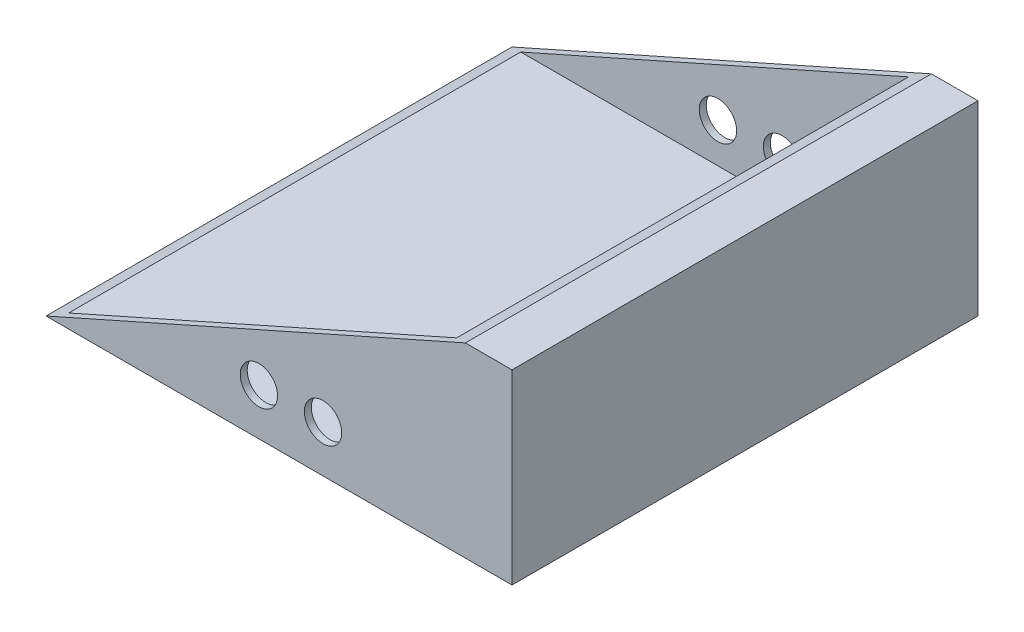
ISO-10303-21;
HEADER;
FILE_DESCRIPTION(('STEP AP214'),'2;1');
FILE_NAME('part.step','',(''),(''),'','','');
FILE_SCHEMA(('AUTOMOTIVE_DESIGN { 1 0 10303 214 1 1 1 1 }'));
ENDSEC;
DATA;
#1=APPLICATION_CONTEXT('core data for automotive mechanical design processes');
#2=APPLICATION_PROTOCOL_DEFINITION('international standard','automotive_design',2000,#1);
#3=PRODUCT_CONTEXT('',#1,'mechanical');
#4=PRODUCT('Part','Part','',(#3));
#5=PRODUCT_RELATED_PRODUCT_CATEGORY('part','',(#4));
#6=PRODUCT_DEFINITION_FORMATION('','',#4);
#7=PRODUCT_DEFINITION_CONTEXT('part definition',#1,'design');
#8=PRODUCT_DEFINITION('design','',#6,#7);
#9=PRODUCT_DEFINITION_SHAPE('','',#8);
#10=(LENGTH_UNIT() NAMED_UNIT(*) SI_UNIT(.MILLI.,.METRE.));
#11=(NAMED_UNIT(*) PLANE_ANGLE_UNIT() SI_UNIT($,.RADIAN.));
#12=(NAMED_UNIT(*) SI_UNIT($,.STERADIAN.) SOLID_ANGLE_UNIT());
#13=UNCERTAINTY_MEASURE_WITH_UNIT(LENGTH_MEASURE(1.E-05),#10,'distance_accuracy_value','');
#14=(GEOMETRIC_REPRESENTATION_CONTEXT(3) GLOBAL_UNCERTAINTY_ASSIGNED_CONTEXT((#13)) GLOBAL_UNIT_ASSIGNED_CONTEXT((#10,
#11,#12)) REPRESENTATION_CONTEXT('',''));
#15=CARTESIAN_POINT('',(0.,0.,0.));
#16=DIRECTION('',(0.,0.,1.));
#17=DIRECTION('',(1.,0.,0.));
#18=AXIS2_PLACEMENT_3D('',#15,#16,#17);
#19=CARTESIAN_POINT('',(180.,80.,200.));
#20=DIRECTION('',(0.406138466053448,-0.913811548620257,0.));
#21=DIRECTION('',(0.913811548620257,0.406138466053448,0.));
#22=AXIS2_PLACEMENT_3D('',#19,#20,#21);
#23=PLANE('',#22);
#24=DIRECTION('',(-0.913811548620257,-0.406138466053448,0.));
#25=VECTOR('',#24,1.);
#26=CARTESIAN_POINT('',(180.,80.,0.));
#27=LINE('',#26,#25);
#28=CARTESIAN_POINT('',(180.,80.,0.));
#29=VERTEX_POINT('',#28);
#30=CARTESIAN_POINT('',(0.,0.,0.));
#31=VERTEX_POINT('',#30);
#32=EDGE_CURVE('E150',#29,#31,#27,.T.);
#33=ORIENTED_EDGE('',*,*,#32,.T.);
#34=DIRECTION('',(0.,0.,-1.));
#35=VECTOR('',#34,1.);
#36=CARTESIAN_POINT('',(0.,0.,200.));
#37=LINE('',#36,#35);
#38=CARTESIAN_POINT('',(0.,0.,200.));
#39=VERTEX_POINT('',#38);
#40=EDGE_CURVE('E11',#39,#31,#37,.T.);
#41=ORIENTED_EDGE('',*,*,#40,.F.);
#42=DIRECTION('',(-0.913811548620257,-0.406138466053448,0.));
#43=VECTOR('',#42,1.);
#44=CARTESIAN_POINT('',(180.,80.,200.));
#45=LINE('',#44,#43);
#46=CARTESIAN_POINT('',(180.,80.,200.));
#47=VERTEX_POINT('',#46);
#48=EDGE_CURVE('E156',#47,#39,#45,.T.);
#49=ORIENTED_EDGE('',*,*,#48,.F.);
#50=DIRECTION('',(0.,0.,-1.));
#51=VECTOR('',#50,1.);
#52=CARTESIAN_POINT('',(180.,80.,200.));
#53=LINE('',#52,#51);
#54=EDGE_CURVE('E162',#47,#29,#53,.T.);
#55=ORIENTED_EDGE('',*,*,#54,.T.);
#56=EDGE_LOOP('',(#33,#41,#49,#55));
#57=FACE_BOUND('',#56,.T.);
#58=DIRECTION('',(-0.913811548620257,-0.406138466053448,0.));
#59=VECTOR('',#58,1.);
#60=CARTESIAN_POINT('',(0.,0.,3.));
#61=LINE('',#60,#59);
#62=CARTESIAN_POINT('',(173.25,77.,3.));
#63=VERTEX_POINT('',#62);
#64=CARTESIAN_POINT('',(6.74999999999997,3.,3.));
#65=VERTEX_POINT('',#64);
#66=EDGE_CURVE('E121',#63,#65,#61,.T.);
#67=ORIENTED_EDGE('',*,*,#66,.F.);
#68=DIRECTION('',(0.,0.,-1.));
#69=VECTOR('',#68,1.);
#70=CARTESIAN_POINT('',(173.25,77.,200.));
#71=LINE('',#70,#69);
#72=CARTESIAN_POINT('',(173.25,77.,197.));
#73=VERTEX_POINT('',#72);
#74=EDGE_CURVE('E144',#73,#63,#71,.T.);
#75=ORIENTED_EDGE('',*,*,#74,.F.);
#76=DIRECTION('',(-0.913811548620257,-0.406138466053448,0.));
#77=VECTOR('',#76,1.);
#78=CARTESIAN_POINT('',(0.,0.,197.));
#79=LINE('',#78,#77);
#80=CARTESIAN_POINT('',(6.74999999999997,3.,197.));
#81=VERTEX_POINT('',#80);
#82=EDGE_CURVE('E55',#73,#81,#79,.T.);
#83=ORIENTED_EDGE('',*,*,#82,.T.);
#84=DIRECTION('',(0.,0.,-1.));
#85=VECTOR('',#84,1.);
#86=CARTESIAN_POINT('',(6.74999999999999,3.,200.));
#87=LINE('',#86,#85);
#88=EDGE_CURVE('E132',#81,#65,#87,.T.);
#89=ORIENTED_EDGE('',*,*,#88,.T.);
#90=EDGE_LOOP('',(#67,#75,#83,#89));
#91=FACE_BOUND('',#90,.T.);
#92=ADVANCED_FACE('F39',(#57,#91),#23,.F.);
#93=CARTESIAN_POINT('',(0.,0.,200.));
#94=DIRECTION('',(0.,1.,0.));
#95=DIRECTION('',(0.,0.,1.));
#96=AXIS2_PLACEMENT_3D('',#93,#94,#95);
#97=PLANE('',#96);
#98=DIRECTION('',(1.,0.,0.));
#99=VECTOR('',#98,1.);
#100=CARTESIAN_POINT('',(0.,0.,0.));
#101=LINE('',#100,#99);
#102=CARTESIAN_POINT('',(200.,0.,0.));
#103=VERTEX_POINT('',#102);
#104=EDGE_CURVE('E165',#31,#103,#101,.T.);
#105=ORIENTED_EDGE('',*,*,#104,.T.);
#106=DIRECTION('',(0.,0.,-1.));
#107=VECTOR('',#106,1.);
#108=CARTESIAN_POINT('',(200.,0.,200.));
#109=LINE('',#108,#107);
#110=CARTESIAN_POINT('',(200.,0.,200.));
#111=VERTEX_POINT('',#110);
#112=EDGE_CURVE('E47',#111,#103,#109,.T.);
#113=ORIENTED_EDGE('',*,*,#112,.F.);
#114=DIRECTION('',(1.,0.,0.));
#115=VECTOR('',#114,1.);
#116=CARTESIAN_POINT('',(0.,0.,200.));
#117=LINE('',#116,#115);
#118=EDGE_CURVE('E92',#39,#111,#117,.T.);
#119=ORIENTED_EDGE('',*,*,#118,.F.);
#120=ORIENTED_EDGE('',*,*,#40,.T.);
#121=EDGE_LOOP('',(#105,#113,#119,#120));
#122=FACE_BOUND('',#121,.T.);
#123=ADVANCED_FACE('F213',(#122),#97,.F.);
#124=CARTESIAN_POINT('',(200.,0.,200.));
#125=DIRECTION('',(-1.,0.,0.));
#126=DIRECTION('',(0.,0.,1.));
#127=AXIS2_PLACEMENT_3D('',#124,#125,#126);
#128=PLANE('',#127);
#129=DIRECTION('',(0.,1.,0.));
#130=VECTOR('',#129,1.);
#131=CARTESIAN_POINT('',(200.,0.,0.));
#132=LINE('',#131,#130);
#133=CARTESIAN_POINT('',(200.,80.,0.));
#134=VERTEX_POINT('',#133);
#135=EDGE_CURVE('E167',#103,#134,#132,.T.);
#136=ORIENTED_EDGE('',*,*,#135,.T.);
#137=DIRECTION('',(0.,0.,-1.));
#138=VECTOR('',#137,1.);
#139=CARTESIAN_POINT('',(200.,80.,200.));
#140=LINE('',#139,#138);
#141=CARTESIAN_POINT('',(200.,80.,200.));
#142=VERTEX_POINT('',#141);
#143=EDGE_CURVE('E171',#142,#134,#140,.T.);
#144=ORIENTED_EDGE('',*,*,#143,.F.);
#145=DIRECTION('',(0.,1.,0.));
#146=VECTOR('',#145,1.);
#147=CARTESIAN_POINT('',(200.,0.,200.));
#148=LINE('',#147,#146);
#149=EDGE_CURVE('E159',#111,#142,#148,.T.);
#150=ORIENTED_EDGE('',*,*,#149,.F.);
#151=ORIENTED_EDGE('',*,*,#112,.T.);
#152=EDGE_LOOP('',(#136,#144,#150,#151));
#153=FACE_BOUND('',#152,.T.);
#154=ADVANCED_FACE('F218',(#153),#128,.F.);
#155=CARTESIAN_POINT('',(200.,80.,200.));
#156=DIRECTION('',(0.,-1.,0.));
#157=DIRECTION('',(1.,0.,0.));
#158=AXIS2_PLACEMENT_3D('',#155,#156,#157);
#159=PLANE('',#158);
#160=DIRECTION('',(-1.,0.,0.));
#161=VECTOR('',#160,1.);
#162=CARTESIAN_POINT('',(200.,80.,0.));
#163=LINE('',#162,#161);
#164=EDGE_CURVE('E85',#134,#29,#163,.T.);
#165=ORIENTED_EDGE('',*,*,#164,.T.);
#166=ORIENTED_EDGE('',*,*,#54,.F.);
#167=DIRECTION('',(-1.,0.,0.));
#168=VECTOR('',#167,1.);
#169=CARTESIAN_POINT('',(200.,80.,200.));
#170=LINE('',#169,#168);
#171=EDGE_CURVE('E64',#142,#47,#170,.T.);
#172=ORIENTED_EDGE('',*,*,#171,.F.);
#173=ORIENTED_EDGE('',*,*,#143,.T.);
#174=EDGE_LOOP('',(#165,#166,#172,#173));
#175=FACE_BOUND('',#174,.T.);
#176=ADVANCED_FACE('F205',(#175),#159,.F.);
#177=CARTESIAN_POINT('',(0.,0.,200.));
#178=DIRECTION('',(0.,0.,-1.));
#179=DIRECTION('',(-1.,0.,0.));
#180=AXIS2_PLACEMENT_3D('',#177,#178,#179);
#181=PLANE('',#180);
#182=CARTESIAN_POINT('',(91.3790345528968,20.,200.));
#183=DIRECTION('',(0.,0.,1.));
#184=DIRECTION('',(1.,0.,0.));
#185=AXIS2_PLACEMENT_3D('',#182,#183,#184);
#186=CIRCLE('',#185,8.02);
#187=CARTESIAN_POINT('',(99.3990345528968,20.,200.));
#188=VERTEX_POINT('',#187);
#189=EDGE_CURVE('E178',#188,#188,#186,.T.);
#190=ORIENTED_EDGE('',*,*,#189,.F.);
#191=EDGE_LOOP('',(#190));
#192=FACE_BOUND('',#191,.T.);
#193=CARTESIAN_POINT('',(118.899034552897,20.,200.));
#194=DIRECTION('',(0.,0.,1.));
#195=DIRECTION('',(1.,0.,0.));
#196=AXIS2_PLACEMENT_3D('',#193,#194,#195);
#197=CIRCLE('',#196,8.02000000000002);
#198=CARTESIAN_POINT('',(126.919034552897,20.,200.));
#199=VERTEX_POINT('',#198);
#200=EDGE_CURVE('E186',#199,#199,#197,.T.);
#201=ORIENTED_EDGE('',*,*,#200,.F.);
#202=EDGE_LOOP('',(#201));
#203=FACE_BOUND('',#202,.T.);
#204=ORIENTED_EDGE('',*,*,#48,.T.);
#205=ORIENTED_EDGE('',*,*,#118,.T.);
#206=ORIENTED_EDGE('',*,*,#149,.T.);
#207=ORIENTED_EDGE('',*,*,#171,.T.);
#208=EDGE_LOOP('',(#204,#205,#206,#207));
#209=FACE_BOUND('',#208,.T.);
#210=ADVANCED_FACE('F202',(#192,#203,#209),#181,.F.);
#211=CARTESIAN_POINT('',(0.,0.,0.));
#212=DIRECTION('',(0.,0.,-1.));
#213=DIRECTION('',(-1.,0.,0.));
#214=AXIS2_PLACEMENT_3D('',#211,#212,#213);
#215=PLANE('',#214);
#216=CARTESIAN_POINT('',(91.3790345528968,20.,0.));
#217=DIRECTION('',(0.,0.,1.));
#218=DIRECTION('',(1.,0.,0.));
#219=AXIS2_PLACEMENT_3D('',#216,#217,#218);
#220=CIRCLE('',#219,8.02);
#221=CARTESIAN_POINT('',(99.3990345528968,20.,0.));
#222=VERTEX_POINT('',#221);
#223=EDGE_CURVE('E182',#222,#222,#220,.T.);
#224=ORIENTED_EDGE('',*,*,#223,.T.);
#225=EDGE_LOOP('',(#224));
#226=FACE_BOUND('',#225,.T.);
#227=CARTESIAN_POINT('',(118.899034552897,20.,0.));
#228=DIRECTION('',(0.,0.,1.));
#229=DIRECTION('',(1.,0.,0.));
#230=AXIS2_PLACEMENT_3D('',#227,#228,#229);
#231=CIRCLE('',#230,8.02000000000002);
#232=CARTESIAN_POINT('',(126.919034552897,20.,0.));
#233=VERTEX_POINT('',#232);
#234=EDGE_CURVE('E188',#233,#233,#231,.T.);
#235=ORIENTED_EDGE('',*,*,#234,.T.);
#236=EDGE_LOOP('',(#235));
#237=FACE_BOUND('',#236,.T.);
#238=ORIENTED_EDGE('',*,*,#32,.F.);
#239=ORIENTED_EDGE('',*,*,#164,.F.);
#240=ORIENTED_EDGE('',*,*,#135,.F.);
#241=ORIENTED_EDGE('',*,*,#104,.F.);
#242=EDGE_LOOP('',(#238,#239,#240,#241));
#243=FACE_BOUND('',#242,.T.);
#244=ADVANCED_FACE('F204',(#226,#237,#243),#215,.T.);
#245=CARTESIAN_POINT('',(0.,3.,200.));
#246=DIRECTION('',(0.,1.,0.));
#247=DIRECTION('',(0.,0.,1.));
#248=AXIS2_PLACEMENT_3D('',#245,#246,#247);
#249=PLANE('',#248);
#250=DIRECTION('',(1.,0.,0.));
#251=VECTOR('',#250,1.);
#252=CARTESIAN_POINT('',(0.,3.,3.));
#253=LINE('',#252,#251);
#254=CARTESIAN_POINT('',(197.,3.,3.));
#255=VERTEX_POINT('',#254);
#256=EDGE_CURVE('E114',#65,#255,#253,.T.);
#257=ORIENTED_EDGE('',*,*,#256,.F.);
#258=ORIENTED_EDGE('',*,*,#88,.F.);
#259=DIRECTION('',(1.,0.,0.));
#260=VECTOR('',#259,1.);
#261=CARTESIAN_POINT('',(0.,3.,197.));
#262=LINE('',#261,#260);
#263=CARTESIAN_POINT('',(197.,3.,197.));
#264=VERTEX_POINT('',#263);
#265=EDGE_CURVE('E129',#81,#264,#262,.T.);
#266=ORIENTED_EDGE('',*,*,#265,.T.);
#267=DIRECTION('',(0.,0.,-1.));
#268=VECTOR('',#267,1.);
#269=CARTESIAN_POINT('',(197.,3.,200.));
#270=LINE('',#269,#268);
#271=EDGE_CURVE('E127',#264,#255,#270,.T.);
#272=ORIENTED_EDGE('',*,*,#271,.T.);
#273=EDGE_LOOP('',(#257,#258,#266,#272));
#274=FACE_BOUND('',#273,.T.);
#275=ADVANCED_FACE('F128',(#274),#249,.T.);
#276=CARTESIAN_POINT('',(197.,0.,200.));
#277=DIRECTION('',(-1.,0.,0.));
#278=DIRECTION('',(0.,0.,1.));
#279=AXIS2_PLACEMENT_3D('',#276,#277,#278);
#280=PLANE('',#279);
#281=DIRECTION('',(0.,1.,0.));
#282=VECTOR('',#281,1.);
#283=CARTESIAN_POINT('',(197.,0.,3.));
#284=LINE('',#283,#282);
#285=CARTESIAN_POINT('',(197.,77.,3.));
#286=VERTEX_POINT('',#285);
#287=EDGE_CURVE('E118',#255,#286,#284,.T.);
#288=ORIENTED_EDGE('',*,*,#287,.F.);
#289=ORIENTED_EDGE('',*,*,#271,.F.);
#290=DIRECTION('',(0.,1.,0.));
#291=VECTOR('',#290,1.);
#292=CARTESIAN_POINT('',(197.,0.,197.));
#293=LINE('',#292,#291);
#294=CARTESIAN_POINT('',(197.,77.,197.));
#295=VERTEX_POINT('',#294);
#296=EDGE_CURVE('E145',#264,#295,#293,.T.);
#297=ORIENTED_EDGE('',*,*,#296,.T.);
#298=DIRECTION('',(0.,0.,-1.));
#299=VECTOR('',#298,1.);
#300=CARTESIAN_POINT('',(197.,77.,200.));
#301=LINE('',#300,#299);
#302=EDGE_CURVE('E133',#295,#286,#301,.T.);
#303=ORIENTED_EDGE('',*,*,#302,.T.);
#304=EDGE_LOOP('',(#288,#289,#297,#303));
#305=FACE_BOUND('',#304,.T.);
#306=ADVANCED_FACE('F135',(#305),#280,.T.);
#307=CARTESIAN_POINT('',(200.,77.,200.));
#308=DIRECTION('',(0.,-1.,0.));
#309=DIRECTION('',(1.,0.,0.));
#310=AXIS2_PLACEMENT_3D('',#307,#308,#309);
#311=PLANE('',#310);
#312=DIRECTION('',(-1.,0.,0.));
#313=VECTOR('',#312,1.);
#314=CARTESIAN_POINT('',(0.,76.9999999999999,3.));
#315=LINE('',#314,#313);
#316=EDGE_CURVE('E138',#286,#63,#315,.T.);
#317=ORIENTED_EDGE('',*,*,#316,.F.);
#318=ORIENTED_EDGE('',*,*,#302,.F.);
#319=DIRECTION('',(-1.,0.,0.));
#320=VECTOR('',#319,1.);
#321=CARTESIAN_POINT('',(0.,76.9999999999999,197.));
#322=LINE('',#321,#320);
#323=EDGE_CURVE('E146',#295,#73,#322,.T.);
#324=ORIENTED_EDGE('',*,*,#323,.T.);
#325=ORIENTED_EDGE('',*,*,#74,.T.);
#326=EDGE_LOOP('',(#317,#318,#324,#325));
#327=FACE_BOUND('',#326,.T.);
#328=ADVANCED_FACE('F254',(#327),#311,.T.);
#329=CARTESIAN_POINT('',(0.,0.,197.));
#330=DIRECTION('',(0.,0.,-1.));
#331=DIRECTION('',(-1.,0.,0.));
#332=AXIS2_PLACEMENT_3D('',#329,#330,#331);
#333=PLANE('',#332);
#334=CARTESIAN_POINT('',(91.3790345528968,20.,197.));
#335=DIRECTION('',(0.,0.,-1.));
#336=DIRECTION('',(-1.,0.,0.));
#337=AXIS2_PLACEMENT_3D('',#334,#335,#336);
#338=CIRCLE('',#337,8.02);
#339=CARTESIAN_POINT('',(83.3590345528968,20.,197.));
#340=VERTEX_POINT('',#339);
#341=EDGE_CURVE('E155',#340,#340,#338,.T.);
#342=ORIENTED_EDGE('',*,*,#341,.F.);
#343=EDGE_LOOP('',(#342));
#344=FACE_BOUND('',#343,.T.);
#345=CARTESIAN_POINT('',(118.899034552897,20.,197.));
#346=DIRECTION('',(0.,0.,-1.));
#347=DIRECTION('',(-1.,0.,0.));
#348=AXIS2_PLACEMENT_3D('',#345,#346,#347);
#349=CIRCLE('',#348,8.02000000000002);
#350=CARTESIAN_POINT('',(110.879034552897,20.,197.));
#351=VERTEX_POINT('',#350);
#352=EDGE_CURVE('E175',#351,#351,#349,.T.);
#353=ORIENTED_EDGE('',*,*,#352,.F.);
#354=EDGE_LOOP('',(#353));
#355=FACE_BOUND('',#354,.T.);
#356=ORIENTED_EDGE('',*,*,#82,.F.);
#357=ORIENTED_EDGE('',*,*,#323,.F.);
#358=ORIENTED_EDGE('',*,*,#296,.F.);
#359=ORIENTED_EDGE('',*,*,#265,.F.);
#360=EDGE_LOOP('',(#356,#357,#358,#359));
#361=FACE_BOUND('',#360,.T.);
#362=ADVANCED_FACE('F259',(#344,#355,#361),#333,.T.);
#363=CARTESIAN_POINT('',(0.,0.,3.));
#364=DIRECTION('',(0.,0.,-1.));
#365=DIRECTION('',(-1.,0.,0.));
#366=AXIS2_PLACEMENT_3D('',#363,#364,#365);
#367=PLANE('',#366);
#368=CARTESIAN_POINT('',(91.3790345528968,20.,3.));
#369=DIRECTION('',(0.,0.,-1.));
#370=DIRECTION('',(-1.,0.,0.));
#371=AXIS2_PLACEMENT_3D('',#368,#369,#370);
#372=CIRCLE('',#371,8.02);
#373=CARTESIAN_POINT('',(83.3590345528968,20.,3.));
#374=VERTEX_POINT('',#373);
#375=EDGE_CURVE('E42',#374,#374,#372,.F.);
#376=ORIENTED_EDGE('',*,*,#375,.F.);
#377=EDGE_LOOP('',(#376));
#378=FACE_BOUND('',#377,.T.);
#379=CARTESIAN_POINT('',(118.899034552897,20.,3.));
#380=DIRECTION('',(0.,0.,-1.));
#381=DIRECTION('',(-1.,0.,0.));
#382=AXIS2_PLACEMENT_3D('',#379,#380,#381);
#383=CIRCLE('',#382,8.02000000000002);
#384=CARTESIAN_POINT('',(110.879034552897,20.,3.));
#385=VERTEX_POINT('',#384);
#386=EDGE_CURVE('E180',#385,#385,#383,.F.);
#387=ORIENTED_EDGE('',*,*,#386,.F.);
#388=EDGE_LOOP('',(#387));
#389=FACE_BOUND('',#388,.T.);
#390=ORIENTED_EDGE('',*,*,#66,.T.);
#391=ORIENTED_EDGE('',*,*,#256,.T.);
#392=ORIENTED_EDGE('',*,*,#287,.T.);
#393=ORIENTED_EDGE('',*,*,#316,.T.);
#394=EDGE_LOOP('',(#390,#391,#392,#393));
#395=FACE_BOUND('',#394,.T.);
#396=ADVANCED_FACE('F116',(#378,#389,#395),#367,.F.);
#397=CARTESIAN_POINT('',(118.899034552897,20.,196.));
#398=DIRECTION('',(0.,0.,1.));
#399=DIRECTION('',(1.,0.,0.));
#400=AXIS2_PLACEMENT_3D('',#397,#398,#399);
#401=CYLINDRICAL_SURFACE('',#400,8.02000000000002);
#402=ORIENTED_EDGE('',*,*,#352,.T.);
#403=EDGE_LOOP('',(#402));
#404=FACE_BOUND('',#403,.T.);
#405=ORIENTED_EDGE('',*,*,#200,.T.);
#406=EDGE_LOOP('',(#405));
#407=FACE_BOUND('',#406,.T.);
#408=ADVANCED_FACE('F200',(#404,#407),#401,.F.);
#409=CARTESIAN_POINT('',(91.3790345528968,20.,196.));
#410=DIRECTION('',(0.,0.,1.));
#411=DIRECTION('',(1.,0.,0.));
#412=AXIS2_PLACEMENT_3D('',#409,#410,#411);
#413=CYLINDRICAL_SURFACE('',#412,8.02);
#414=ORIENTED_EDGE('',*,*,#341,.T.);
#415=EDGE_LOOP('',(#414));
#416=FACE_BOUND('',#415,.T.);
#417=ORIENTED_EDGE('',*,*,#189,.T.);
#418=EDGE_LOOP('',(#417));
#419=FACE_BOUND('',#418,.T.);
#420=ADVANCED_FACE('F277',(#416,#419),#413,.F.);
#421=CARTESIAN_POINT('',(118.899034552897,20.,4.));
#422=DIRECTION('',(0.,0.,-1.));
#423=DIRECTION('',(-1.,0.,0.));
#424=AXIS2_PLACEMENT_3D('',#421,#422,#423);
#425=CYLINDRICAL_SURFACE('',#424,8.02000000000002);
#426=ORIENTED_EDGE('',*,*,#234,.F.);
#427=EDGE_LOOP('',(#426));
#428=FACE_BOUND('',#427,.T.);
#429=ORIENTED_EDGE('',*,*,#386,.T.);
#430=EDGE_LOOP('',(#429));
#431=FACE_BOUND('',#430,.T.);
#432=ADVANCED_FACE('F288',(#428,#431),#425,.F.);
#433=CARTESIAN_POINT('',(91.3790345528968,20.,4.));
#434=DIRECTION('',(0.,0.,-1.));
#435=DIRECTION('',(-1.,0.,0.));
#436=AXIS2_PLACEMENT_3D('',#433,#434,#435);
#437=CYLINDRICAL_SURFACE('',#436,8.02);
#438=ORIENTED_EDGE('',*,*,#223,.F.);
#439=EDGE_LOOP('',(#438));
#440=FACE_BOUND('',#439,.T.);
#441=ORIENTED_EDGE('',*,*,#375,.T.);
#442=EDGE_LOOP('',(#441));
#443=FACE_BOUND('',#442,.T.);
#444=ADVANCED_FACE('F313',(#440,#443),#437,.F.);
#445=CLOSED_SHELL('',(#92,#123,#154,#176,#210,#244,#275,#306,#328,#362,#396,#408,#420,#432,#444));
#446=MANIFOLD_SOLID_BREP('B2',#445);
#447=ADVANCED_BREP_SHAPE_REPRESENTATION('',(#18,#446),#14);
#448=SHAPE_DEFINITION_REPRESENTATION(#9,#447);
ENDSEC;
END-ISO-10303-21;
